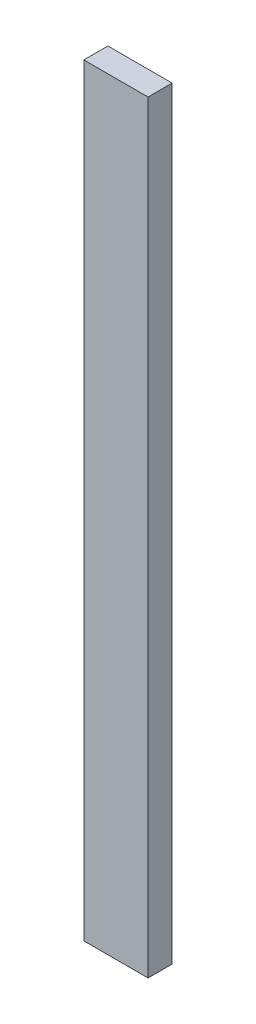
ISO-10303-21;
HEADER;
FILE_DESCRIPTION(('STEP AP214'),'2;1');
FILE_NAME('part.step','',(''),(''),'','','');
FILE_SCHEMA(('AUTOMOTIVE_DESIGN { 1 0 10303 214 1 1 1 1 }'));
ENDSEC;
DATA;
#1=APPLICATION_CONTEXT('core data for automotive mechanical design processes');
#2=APPLICATION_PROTOCOL_DEFINITION('international standard','automotive_design',2000,#1);
#3=PRODUCT_CONTEXT('',#1,'mechanical');
#4=PRODUCT('Part','Part','',(#3));
#5=PRODUCT_RELATED_PRODUCT_CATEGORY('part','',(#4));
#6=PRODUCT_DEFINITION_FORMATION('','',#4);
#7=PRODUCT_DEFINITION_CONTEXT('part definition',#1,'design');
#8=PRODUCT_DEFINITION('design','',#6,#7);
#9=PRODUCT_DEFINITION_SHAPE('','',#8);
#10=(LENGTH_UNIT() NAMED_UNIT(*) SI_UNIT(.MILLI.,.METRE.));
#11=(NAMED_UNIT(*) PLANE_ANGLE_UNIT() SI_UNIT($,.RADIAN.));
#12=(NAMED_UNIT(*) SI_UNIT($,.STERADIAN.) SOLID_ANGLE_UNIT());
#13=UNCERTAINTY_MEASURE_WITH_UNIT(LENGTH_MEASURE(1.E-05),#10,'distance_accuracy_value','');
#14=(GEOMETRIC_REPRESENTATION_CONTEXT(3) GLOBAL_UNCERTAINTY_ASSIGNED_CONTEXT((#13)) GLOBAL_UNIT_ASSIGNED_CONTEXT((#10,
#11,#12)) REPRESENTATION_CONTEXT('',''));
#15=CARTESIAN_POINT('',(0.,0.,0.));
#16=DIRECTION('',(0.,0.,1.));
#17=DIRECTION('',(1.,0.,0.));
#18=AXIS2_PLACEMENT_3D('',#15,#16,#17);
#19=CARTESIAN_POINT('',(25.4,-301.625,19.05));
#20=DIRECTION('',(-1.,0.,0.));
#21=DIRECTION('',(0.,0.,1.));
#22=AXIS2_PLACEMENT_3D('',#19,#20,#21);
#23=PLANE('',#22);
#24=DIRECTION('',(0.,1.,0.));
#25=VECTOR('',#24,1.);
#26=CARTESIAN_POINT('',(25.4,-301.625,0.));
#27=LINE('',#26,#25);
#28=CARTESIAN_POINT('',(25.4,-301.625,0.));
#29=VERTEX_POINT('',#28);
#30=CARTESIAN_POINT('',(25.4,301.625,0.));
#31=VERTEX_POINT('',#30);
#32=EDGE_CURVE('E96',#29,#31,#27,.T.);
#33=ORIENTED_EDGE('',*,*,#32,.T.);
#34=DIRECTION('',(0.,0.,-1.));
#35=VECTOR('',#34,1.);
#36=CARTESIAN_POINT('',(25.4,301.625,19.05));
#37=LINE('',#36,#35);
#38=CARTESIAN_POINT('',(25.4,301.625,19.05));
#39=VERTEX_POINT('',#38);
#40=EDGE_CURVE('E11',#39,#31,#37,.T.);
#41=ORIENTED_EDGE('',*,*,#40,.F.);
#42=DIRECTION('',(0.,1.,0.));
#43=VECTOR('',#42,1.);
#44=CARTESIAN_POINT('',(25.4,-301.625,19.05));
#45=LINE('',#44,#43);
#46=CARTESIAN_POINT('',(25.4,-301.625,19.05));
#47=VERTEX_POINT('',#46);
#48=EDGE_CURVE('E84',#47,#39,#45,.T.);
#49=ORIENTED_EDGE('',*,*,#48,.F.);
#50=DIRECTION('',(0.,0.,-1.));
#51=VECTOR('',#50,1.);
#52=CARTESIAN_POINT('',(25.4,-301.625,19.05));
#53=LINE('',#52,#51);
#54=EDGE_CURVE('E92',#47,#29,#53,.T.);
#55=ORIENTED_EDGE('',*,*,#54,.T.);
#56=EDGE_LOOP('',(#33,#41,#49,#55));
#57=FACE_BOUND('',#56,.T.);
#58=ADVANCED_FACE('F33',(#57),#23,.F.);
#59=CARTESIAN_POINT('',(-25.4,301.625,19.05));
#60=DIRECTION('',(0.,-1.,0.));
#61=DIRECTION('',(0.,0.,-1.));
#62=AXIS2_PLACEMENT_3D('',#59,#60,#61);
#63=PLANE('',#62);
#64=DIRECTION('',(-1.,0.,0.));
#65=VECTOR('',#64,1.);
#66=CARTESIAN_POINT('',(-25.4,301.625,0.));
#67=LINE('',#66,#65);
#68=CARTESIAN_POINT('',(-25.4,301.625,0.));
#69=VERTEX_POINT('',#68);
#70=EDGE_CURVE('E88',#31,#69,#67,.T.);
#71=ORIENTED_EDGE('',*,*,#70,.T.);
#72=DIRECTION('',(0.,0.,-1.));
#73=VECTOR('',#72,1.);
#74=CARTESIAN_POINT('',(-25.4,301.625,19.05));
#75=LINE('',#74,#73);
#76=CARTESIAN_POINT('',(-25.4,301.625,19.05));
#77=VERTEX_POINT('',#76);
#78=EDGE_CURVE('E41',#77,#69,#75,.T.);
#79=ORIENTED_EDGE('',*,*,#78,.F.);
#80=DIRECTION('',(-1.,0.,0.));
#81=VECTOR('',#80,1.);
#82=CARTESIAN_POINT('',(-25.4,301.625,19.05));
#83=LINE('',#82,#81);
#84=EDGE_CURVE('E79',#39,#77,#83,.T.);
#85=ORIENTED_EDGE('',*,*,#84,.F.);
#86=ORIENTED_EDGE('',*,*,#40,.T.);
#87=EDGE_LOOP('',(#71,#79,#85,#86));
#88=FACE_BOUND('',#87,.T.);
#89=ADVANCED_FACE('F87',(#88),#63,.F.);
#90=CARTESIAN_POINT('',(-25.4,-301.625,19.05));
#91=DIRECTION('',(1.,0.,0.));
#92=DIRECTION('',(0.,0.,-1.));
#93=AXIS2_PLACEMENT_3D('',#90,#91,#92);
#94=PLANE('',#93);
#95=DIRECTION('',(0.,-1.,0.));
#96=VECTOR('',#95,1.);
#97=CARTESIAN_POINT('',(-25.4,-301.625,0.));
#98=LINE('',#97,#96);
#99=CARTESIAN_POINT('',(-25.4,-301.625,0.));
#100=VERTEX_POINT('',#99);
#101=EDGE_CURVE('E66',#69,#100,#98,.T.);
#102=ORIENTED_EDGE('',*,*,#101,.T.);
#103=DIRECTION('',(0.,0.,-1.));
#104=VECTOR('',#103,1.);
#105=CARTESIAN_POINT('',(-25.4,-301.625,19.05));
#106=LINE('',#105,#104);
#107=CARTESIAN_POINT('',(-25.4,-301.625,19.05));
#108=VERTEX_POINT('',#107);
#109=EDGE_CURVE('E89',#108,#100,#106,.T.);
#110=ORIENTED_EDGE('',*,*,#109,.F.);
#111=DIRECTION('',(0.,-1.,0.));
#112=VECTOR('',#111,1.);
#113=CARTESIAN_POINT('',(-25.4,-301.625,19.05));
#114=LINE('',#113,#112);
#115=EDGE_CURVE('E82',#77,#108,#114,.T.);
#116=ORIENTED_EDGE('',*,*,#115,.F.);
#117=ORIENTED_EDGE('',*,*,#78,.T.);
#118=EDGE_LOOP('',(#102,#110,#116,#117));
#119=FACE_BOUND('',#118,.T.);
#120=ADVANCED_FACE('F90',(#119),#94,.F.);
#121=CARTESIAN_POINT('',(-25.4,-301.625,19.05));
#122=DIRECTION('',(0.,1.,0.));
#123=DIRECTION('',(0.,0.,1.));
#124=AXIS2_PLACEMENT_3D('',#121,#122,#123);
#125=PLANE('',#124);
#126=DIRECTION('',(1.,0.,0.));
#127=VECTOR('',#126,1.);
#128=CARTESIAN_POINT('',(-25.4,-301.625,0.));
#129=LINE('',#128,#127);
#130=EDGE_CURVE('E72',#100,#29,#129,.T.);
#131=ORIENTED_EDGE('',*,*,#130,.T.);
#132=ORIENTED_EDGE('',*,*,#54,.F.);
#133=DIRECTION('',(1.,0.,0.));
#134=VECTOR('',#133,1.);
#135=CARTESIAN_POINT('',(-25.4,-301.625,19.05));
#136=LINE('',#135,#134);
#137=EDGE_CURVE('E49',#108,#47,#136,.T.);
#138=ORIENTED_EDGE('',*,*,#137,.F.);
#139=ORIENTED_EDGE('',*,*,#109,.T.);
#140=EDGE_LOOP('',(#131,#132,#138,#139));
#141=FACE_BOUND('',#140,.T.);
#142=ADVANCED_FACE('F103',(#141),#125,.F.);
#143=CARTESIAN_POINT('',(0.,0.,19.05));
#144=DIRECTION('',(0.,0.,-1.));
#145=DIRECTION('',(-1.,0.,0.));
#146=AXIS2_PLACEMENT_3D('',#143,#144,#145);
#147=PLANE('',#146);
#148=ORIENTED_EDGE('',*,*,#48,.T.);
#149=ORIENTED_EDGE('',*,*,#84,.T.);
#150=ORIENTED_EDGE('',*,*,#115,.T.);
#151=ORIENTED_EDGE('',*,*,#137,.T.);
#152=EDGE_LOOP('',(#148,#149,#150,#151));
#153=FACE_BOUND('',#152,.T.);
#154=ADVANCED_FACE('F80',(#153),#147,.F.);
#155=CARTESIAN_POINT('',(0.,0.,0.));
#156=DIRECTION('',(0.,0.,-1.));
#157=DIRECTION('',(-1.,0.,0.));
#158=AXIS2_PLACEMENT_3D('',#155,#156,#157);
#159=PLANE('',#158);
#160=ORIENTED_EDGE('',*,*,#32,.F.);
#161=ORIENTED_EDGE('',*,*,#130,.F.);
#162=ORIENTED_EDGE('',*,*,#101,.F.);
#163=ORIENTED_EDGE('',*,*,#70,.F.);
#164=EDGE_LOOP('',(#160,#161,#162,#163));
#165=FACE_BOUND('',#164,.T.);
#166=ADVANCED_FACE('F106',(#165),#159,.T.);
#167=CLOSED_SHELL('',(#58,#89,#120,#142,#154,#166));
#168=MANIFOLD_SOLID_BREP('B2',#167);
#169=ADVANCED_BREP_SHAPE_REPRESENTATION('',(#18,#168),#14);
#170=SHAPE_DEFINITION_REPRESENTATION(#9,#169);
ENDSEC;
END-ISO-10303-21;
